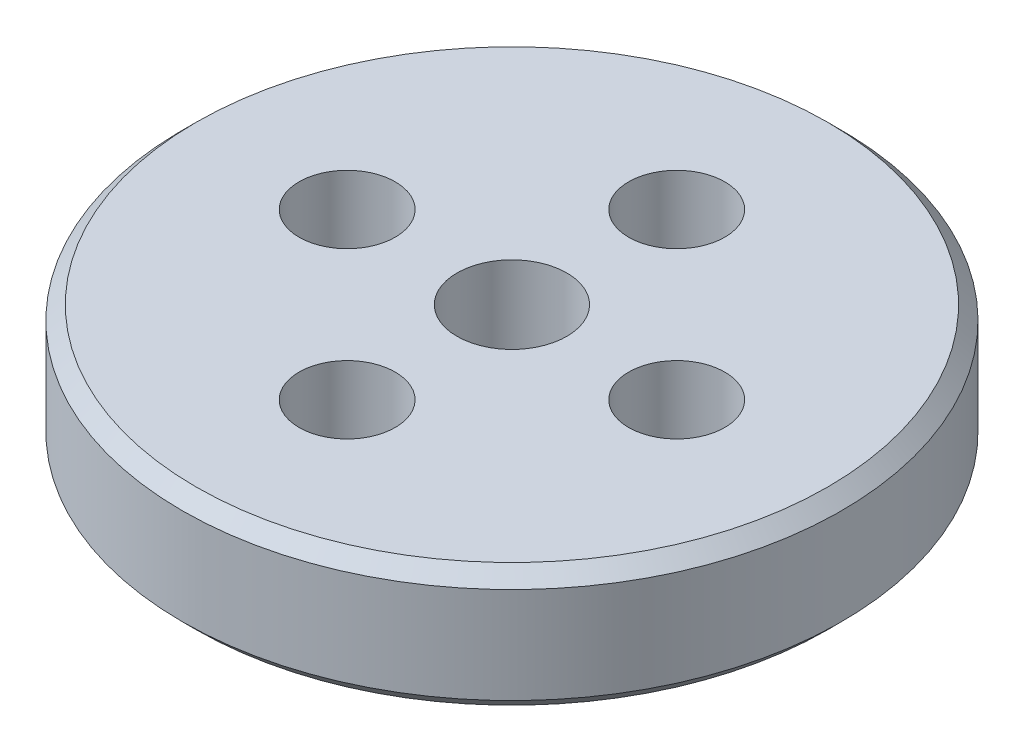
ISO-10303-21;
HEADER;
FILE_DESCRIPTION(('STEP AP214'),'2;1');
FILE_NAME('part.step','',(''),(''),'','','');
FILE_SCHEMA(('AUTOMOTIVE_DESIGN { 1 0 10303 214 1 1 1 1 }'));
ENDSEC;
DATA;
#1=APPLICATION_CONTEXT('core data for automotive mechanical design processes');
#2=APPLICATION_PROTOCOL_DEFINITION('international standard','automotive_design',2000,#1);
#3=PRODUCT_CONTEXT('',#1,'mechanical');
#4=PRODUCT('Part','Part','',(#3));
#5=PRODUCT_RELATED_PRODUCT_CATEGORY('part','',(#4));
#6=PRODUCT_DEFINITION_FORMATION('','',#4);
#7=PRODUCT_DEFINITION_CONTEXT('part definition',#1,'design');
#8=PRODUCT_DEFINITION('design','',#6,#7);
#9=PRODUCT_DEFINITION_SHAPE('','',#8);
#10=(LENGTH_UNIT() NAMED_UNIT(*) SI_UNIT(.MILLI.,.METRE.));
#11=(NAMED_UNIT(*) PLANE_ANGLE_UNIT() SI_UNIT($,.RADIAN.));
#12=(NAMED_UNIT(*) SI_UNIT($,.STERADIAN.) SOLID_ANGLE_UNIT());
#13=UNCERTAINTY_MEASURE_WITH_UNIT(LENGTH_MEASURE(1.E-05),#10,'distance_accuracy_value','');
#14=(GEOMETRIC_REPRESENTATION_CONTEXT(3) GLOBAL_UNCERTAINTY_ASSIGNED_CONTEXT((#13)) GLOBAL_UNIT_ASSIGNED_CONTEXT((#10,
#11,#12)) REPRESENTATION_CONTEXT('',''));
#15=CARTESIAN_POINT('',(0.,0.,0.));
#16=DIRECTION('',(0.,0.,1.));
#17=DIRECTION('',(1.,0.,0.));
#18=AXIS2_PLACEMENT_3D('',#15,#16,#17);
#19=CARTESIAN_POINT('',(0.,9.,0.));
#20=DIRECTION('',(0.,-1.,0.));
#21=DIRECTION('',(0.,0.,-1.));
#22=AXIS2_PLACEMENT_3D('',#19,#20,#21);
#23=CYLINDRICAL_SURFACE('',#22,24.);
#24=CARTESIAN_POINT('',(0.,1.,0.));
#25=DIRECTION('',(0.,1.,0.));
#26=DIRECTION('',(0.,0.,1.));
#27=AXIS2_PLACEMENT_3D('',#24,#25,#26);
#28=CIRCLE('',#27,24.);
#29=CARTESIAN_POINT('',(0.,1.,24.));
#30=VERTEX_POINT('',#29);
#31=EDGE_CURVE('E60',#30,#30,#28,.T.);
#32=ORIENTED_EDGE('',*,*,#31,.T.);
#33=EDGE_LOOP('',(#32));
#34=FACE_BOUND('',#33,.T.);
#35=CARTESIAN_POINT('',(0.,8.00000000000002,0.));
#36=DIRECTION('',(0.,1.,0.));
#37=DIRECTION('',(0.,0.,1.));
#38=AXIS2_PLACEMENT_3D('',#35,#36,#37);
#39=CIRCLE('',#38,24.);
#40=CARTESIAN_POINT('',(0.,8.00000000000002,24.));
#41=VERTEX_POINT('',#40);
#42=EDGE_CURVE('E66',#41,#41,#39,.F.);
#43=ORIENTED_EDGE('',*,*,#42,.T.);
#44=EDGE_LOOP('',(#43));
#45=FACE_BOUND('',#44,.T.);
#46=ADVANCED_FACE('F41',(#34,#45),#23,.T.);
#47=CARTESIAN_POINT('',(0.,9.,0.));
#48=DIRECTION('',(0.,1.,0.));
#49=DIRECTION('',(0.,0.,1.));
#50=AXIS2_PLACEMENT_3D('',#47,#48,#49);
#51=PLANE('',#50);
#52=CARTESIAN_POINT('',(0.,9.,0.));
#53=DIRECTION('',(0.,1.,0.));
#54=DIRECTION('',(0.,0.,1.));
#55=AXIS2_PLACEMENT_3D('',#52,#53,#54);
#56=CIRCLE('',#55,23.);
#57=CARTESIAN_POINT('',(0.,9.,23.));
#58=VERTEX_POINT('',#57);
#59=EDGE_CURVE('E50',#58,#58,#56,.T.);
#60=ORIENTED_EDGE('',*,*,#59,.T.);
#61=EDGE_LOOP('',(#60));
#62=FACE_BOUND('',#61,.T.);
#63=CARTESIAN_POINT('',(-11.9999999999997,9.,3.4032572508536E-13));
#64=DIRECTION('',(0.,1.,0.));
#65=DIRECTION('',(0.,0.,1.));
#66=AXIS2_PLACEMENT_3D('',#63,#64,#65);
#67=CIRCLE('',#66,3.50000000000054);
#68=CARTESIAN_POINT('',(-11.9999999999997,9.,3.50000000000089));
#69=VERTEX_POINT('',#68);
#70=EDGE_CURVE('E79',#69,#69,#67,.T.);
#71=ORIENTED_EDGE('',*,*,#70,.F.);
#72=EDGE_LOOP('',(#71));
#73=FACE_BOUND('',#72,.T.);
#74=CARTESIAN_POINT('',(6.77712297852766E-13,9.,12.));
#75=DIRECTION('',(0.,1.,0.));
#76=DIRECTION('',(0.,0.,1.));
#77=AXIS2_PLACEMENT_3D('',#74,#75,#76);
#78=CIRCLE('',#77,3.50000000000073);
#79=CARTESIAN_POINT('',(6.77712297852766E-13,9.,15.5000000000007));
#80=VERTEX_POINT('',#79);
#81=EDGE_CURVE('E107',#80,#80,#78,.T.);
#82=ORIENTED_EDGE('',*,*,#81,.F.);
#83=EDGE_LOOP('',(#82));
#84=FACE_BOUND('',#83,.T.);
#85=CARTESIAN_POINT('',(12.,9.,0.));
#86=DIRECTION('',(0.,1.,0.));
#87=DIRECTION('',(0.,0.,1.));
#88=AXIS2_PLACEMENT_3D('',#85,#86,#87);
#89=CIRCLE('',#88,3.5);
#90=CARTESIAN_POINT('',(12.,9.,3.50000000000004));
#91=VERTEX_POINT('',#90);
#92=EDGE_CURVE('E103',#91,#91,#89,.T.);
#93=ORIENTED_EDGE('',*,*,#92,.F.);
#94=EDGE_LOOP('',(#93));
#95=FACE_BOUND('',#94,.T.);
#96=CARTESIAN_POINT('',(0.,9.,-12.));
#97=DIRECTION('',(0.,1.,0.));
#98=DIRECTION('',(0.,0.,1.));
#99=AXIS2_PLACEMENT_3D('',#96,#97,#98);
#100=CIRCLE('',#99,3.5);
#101=CARTESIAN_POINT('',(0.,9.,-8.5));
#102=VERTEX_POINT('',#101);
#103=EDGE_CURVE('E99',#102,#102,#100,.T.);
#104=ORIENTED_EDGE('',*,*,#103,.F.);
#105=EDGE_LOOP('',(#104));
#106=FACE_BOUND('',#105,.T.);
#107=CARTESIAN_POINT('',(0.,9.,0.));
#108=DIRECTION('',(0.,1.,0.));
#109=DIRECTION('',(0.,0.,1.));
#110=AXIS2_PLACEMENT_3D('',#107,#108,#109);
#111=CIRCLE('',#110,4.);
#112=CARTESIAN_POINT('',(0.,9.,4.));
#113=VERTEX_POINT('',#112);
#114=EDGE_CURVE('E74',#113,#113,#111,.T.);
#115=ORIENTED_EDGE('',*,*,#114,.F.);
#116=EDGE_LOOP('',(#115));
#117=FACE_BOUND('',#116,.T.);
#118=ADVANCED_FACE('F118',(#62,#73,#84,#95,#106,#117),#51,.T.);
#119=CARTESIAN_POINT('',(0.,0.,0.));
#120=DIRECTION('',(0.,1.,0.));
#121=DIRECTION('',(0.,0.,1.));
#122=AXIS2_PLACEMENT_3D('',#119,#120,#121);
#123=PLANE('',#122);
#124=CARTESIAN_POINT('',(0.,0.,0.));
#125=DIRECTION('',(0.,1.,0.));
#126=DIRECTION('',(0.,0.,1.));
#127=AXIS2_PLACEMENT_3D('',#124,#125,#126);
#128=CIRCLE('',#127,23.);
#129=CARTESIAN_POINT('',(0.,0.,23.));
#130=VERTEX_POINT('',#129);
#131=EDGE_CURVE('E55',#130,#130,#128,.F.);
#132=ORIENTED_EDGE('',*,*,#131,.T.);
#133=EDGE_LOOP('',(#132));
#134=FACE_BOUND('',#133,.T.);
#135=CARTESIAN_POINT('',(0.,0.,0.));
#136=DIRECTION('',(0.,1.,0.));
#137=DIRECTION('',(0.,0.,1.));
#138=AXIS2_PLACEMENT_3D('',#135,#136,#137);
#139=CIRCLE('',#138,18.);
#140=CARTESIAN_POINT('',(0.,0.,18.));
#141=VERTEX_POINT('',#140);
#142=EDGE_CURVE('E70',#141,#141,#139,.T.);
#143=ORIENTED_EDGE('',*,*,#142,.T.);
#144=EDGE_LOOP('',(#143));
#145=FACE_BOUND('',#144,.T.);
#146=ADVANCED_FACE('F121',(#134,#145),#123,.F.);
#147=CARTESIAN_POINT('',(0.,9.,-12.));
#148=DIRECTION('',(0.,-1.,0.));
#149=DIRECTION('',(0.,0.,-1.));
#150=AXIS2_PLACEMENT_3D('',#147,#148,#149);
#151=CYLINDRICAL_SURFACE('',#150,3.5);
#152=ORIENTED_EDGE('',*,*,#103,.T.);
#153=EDGE_LOOP('',(#152));
#154=FACE_BOUND('',#153,.T.);
#155=CARTESIAN_POINT('',(0.,2.,-12.));
#156=DIRECTION('',(0.,1.,0.));
#157=DIRECTION('',(0.,0.,1.));
#158=AXIS2_PLACEMENT_3D('',#155,#156,#157);
#159=CIRCLE('',#158,3.5);
#160=CARTESIAN_POINT('',(0.,2.,-8.5));
#161=VERTEX_POINT('',#160);
#162=EDGE_CURVE('E80',#161,#161,#159,.T.);
#163=ORIENTED_EDGE('',*,*,#162,.F.);
#164=EDGE_LOOP('',(#163));
#165=FACE_BOUND('',#164,.T.);
#166=ADVANCED_FACE('F175',(#154,#165),#151,.F.);
#167=CARTESIAN_POINT('',(12.,9.,0.));
#168=DIRECTION('',(0.,-1.,0.));
#169=DIRECTION('',(0.,0.,-1.));
#170=AXIS2_PLACEMENT_3D('',#167,#168,#169);
#171=CYLINDRICAL_SURFACE('',#170,3.5);
#172=ORIENTED_EDGE('',*,*,#92,.T.);
#173=EDGE_LOOP('',(#172));
#174=FACE_BOUND('',#173,.T.);
#175=CARTESIAN_POINT('',(12.,2.,0.));
#176=DIRECTION('',(0.,1.,0.));
#177=DIRECTION('',(0.,0.,1.));
#178=AXIS2_PLACEMENT_3D('',#175,#176,#177);
#179=CIRCLE('',#178,3.5);
#180=CARTESIAN_POINT('',(12.,2.,3.50000000000004));
#181=VERTEX_POINT('',#180);
#182=EDGE_CURVE('E84',#181,#181,#179,.T.);
#183=ORIENTED_EDGE('',*,*,#182,.F.);
#184=EDGE_LOOP('',(#183));
#185=FACE_BOUND('',#184,.T.);
#186=ADVANCED_FACE('F180',(#174,#185),#171,.F.);
#187=CARTESIAN_POINT('',(6.77712297852766E-13,9.,12.));
#188=DIRECTION('',(0.,-1.,0.));
#189=DIRECTION('',(0.,0.,-1.));
#190=AXIS2_PLACEMENT_3D('',#187,#188,#189);
#191=CYLINDRICAL_SURFACE('',#190,3.50000000000073);
#192=ORIENTED_EDGE('',*,*,#81,.T.);
#193=EDGE_LOOP('',(#192));
#194=FACE_BOUND('',#193,.T.);
#195=CARTESIAN_POINT('',(6.77712297852766E-13,2.,12.));
#196=DIRECTION('',(0.,1.,0.));
#197=DIRECTION('',(0.,0.,1.));
#198=AXIS2_PLACEMENT_3D('',#195,#196,#197);
#199=CIRCLE('',#198,3.50000000000073);
#200=CARTESIAN_POINT('',(6.77712297852766E-13,2.,15.5000000000007));
#201=VERTEX_POINT('',#200);
#202=EDGE_CURVE('E88',#201,#201,#199,.T.);
#203=ORIENTED_EDGE('',*,*,#202,.F.);
#204=EDGE_LOOP('',(#203));
#205=FACE_BOUND('',#204,.T.);
#206=ADVANCED_FACE('F189',(#194,#205),#191,.F.);
#207=CARTESIAN_POINT('',(-11.9999999999997,9.,3.4032572508536E-13));
#208=DIRECTION('',(0.,-1.,0.));
#209=DIRECTION('',(0.,0.,-1.));
#210=AXIS2_PLACEMENT_3D('',#207,#208,#209);
#211=CYLINDRICAL_SURFACE('',#210,3.50000000000054);
#212=ORIENTED_EDGE('',*,*,#70,.T.);
#213=EDGE_LOOP('',(#212));
#214=FACE_BOUND('',#213,.T.);
#215=CARTESIAN_POINT('',(-11.9999999999997,2.,3.4032572508536E-13));
#216=DIRECTION('',(0.,1.,0.));
#217=DIRECTION('',(0.,0.,1.));
#218=AXIS2_PLACEMENT_3D('',#215,#216,#217);
#219=CIRCLE('',#218,3.50000000000054);
#220=CARTESIAN_POINT('',(-11.9999999999997,2.,3.50000000000089));
#221=VERTEX_POINT('',#220);
#222=EDGE_CURVE('E92',#221,#221,#219,.T.);
#223=ORIENTED_EDGE('',*,*,#222,.F.);
#224=EDGE_LOOP('',(#223));
#225=FACE_BOUND('',#224,.T.);
#226=ADVANCED_FACE('F115',(#214,#225),#211,.F.);
#227=CARTESIAN_POINT('',(0.,9.,0.));
#228=DIRECTION('',(0.,-1.,0.));
#229=DIRECTION('',(0.,0.,-1.));
#230=AXIS2_PLACEMENT_3D('',#227,#228,#229);
#231=CYLINDRICAL_SURFACE('',#230,4.);
#232=ORIENTED_EDGE('',*,*,#114,.T.);
#233=EDGE_LOOP('',(#232));
#234=FACE_BOUND('',#233,.T.);
#235=CARTESIAN_POINT('',(0.,2.,0.));
#236=DIRECTION('',(0.,1.,0.));
#237=DIRECTION('',(0.,0.,1.));
#238=AXIS2_PLACEMENT_3D('',#235,#236,#237);
#239=CIRCLE('',#238,4.);
#240=CARTESIAN_POINT('',(0.,2.,4.));
#241=VERTEX_POINT('',#240);
#242=EDGE_CURVE('E75',#241,#241,#239,.T.);
#243=ORIENTED_EDGE('',*,*,#242,.F.);
#244=EDGE_LOOP('',(#243));
#245=FACE_BOUND('',#244,.T.);
#246=ADVANCED_FACE('F131',(#234,#245),#231,.F.);
#247=CARTESIAN_POINT('',(0.,2.,0.));
#248=DIRECTION('',(0.,1.,0.));
#249=DIRECTION('',(0.,0.,1.));
#250=AXIS2_PLACEMENT_3D('',#247,#248,#249);
#251=PLANE('',#250);
#252=CARTESIAN_POINT('',(0.,2.,0.));
#253=DIRECTION('',(0.,1.,0.));
#254=DIRECTION('',(0.,0.,1.));
#255=AXIS2_PLACEMENT_3D('',#252,#253,#254);
#256=CIRCLE('',#255,16.);
#257=CARTESIAN_POINT('',(0.,2.,16.));
#258=VERTEX_POINT('',#257);
#259=EDGE_CURVE('E10',#258,#258,#256,.F.);
#260=ORIENTED_EDGE('',*,*,#259,.T.);
#261=EDGE_LOOP('',(#260));
#262=FACE_BOUND('',#261,.T.);
#263=ORIENTED_EDGE('',*,*,#222,.T.);
#264=EDGE_LOOP('',(#263));
#265=FACE_BOUND('',#264,.T.);
#266=ORIENTED_EDGE('',*,*,#202,.T.);
#267=EDGE_LOOP('',(#266));
#268=FACE_BOUND('',#267,.T.);
#269=ORIENTED_EDGE('',*,*,#182,.T.);
#270=EDGE_LOOP('',(#269));
#271=FACE_BOUND('',#270,.T.);
#272=ORIENTED_EDGE('',*,*,#162,.T.);
#273=EDGE_LOOP('',(#272));
#274=FACE_BOUND('',#273,.T.);
#275=ORIENTED_EDGE('',*,*,#242,.T.);
#276=EDGE_LOOP('',(#275));
#277=FACE_BOUND('',#276,.T.);
#278=ADVANCED_FACE('F134',(#262,#265,#268,#271,#274,#277),#251,.F.);
#279=CARTESIAN_POINT('',(0.,1.,0.));
#280=DIRECTION('',(0.,1.,0.));
#281=DIRECTION('',(0.,0.,1.));
#282=AXIS2_PLACEMENT_3D('',#279,#280,#281);
#283=CONICAL_SURFACE('',#282,24.,0.785398163397452);
#284=ORIENTED_EDGE('',*,*,#131,.F.);
#285=EDGE_LOOP('',(#284));
#286=FACE_BOUND('',#285,.T.);
#287=ORIENTED_EDGE('',*,*,#31,.F.);
#288=EDGE_LOOP('',(#287));
#289=FACE_BOUND('',#288,.T.);
#290=ADVANCED_FACE('F139',(#286,#289),#283,.T.);
#291=CARTESIAN_POINT('',(0.,9.,0.));
#292=DIRECTION('',(0.,-1.,0.));
#293=DIRECTION('',(0.,0.,-1.));
#294=AXIS2_PLACEMENT_3D('',#291,#292,#293);
#295=CONICAL_SURFACE('',#294,23.,0.785398163397448);
#296=ORIENTED_EDGE('',*,*,#42,.F.);
#297=EDGE_LOOP('',(#296));
#298=FACE_BOUND('',#297,.T.);
#299=ORIENTED_EDGE('',*,*,#59,.F.);
#300=EDGE_LOOP('',(#299));
#301=FACE_BOUND('',#300,.T.);
#302=ADVANCED_FACE('F144',(#298,#301),#295,.T.);
#303=CARTESIAN_POINT('',(0.,0.,0.));
#304=DIRECTION('',(0.,-1.,0.));
#305=DIRECTION('',(0.,0.,-1.));
#306=AXIS2_PLACEMENT_3D('',#303,#304,#305);
#307=CONICAL_SURFACE('',#306,18.,0.785398163397443);
#308=ORIENTED_EDGE('',*,*,#259,.F.);
#309=EDGE_LOOP('',(#308));
#310=FACE_BOUND('',#309,.T.);
#311=ORIENTED_EDGE('',*,*,#142,.F.);
#312=EDGE_LOOP('',(#311));
#313=FACE_BOUND('',#312,.T.);
#314=ADVANCED_FACE('F44',(#310,#313),#307,.F.);
#315=CLOSED_SHELL('',(#46,#118,#146,#166,#186,#206,#226,#246,#278,#290,#302,#314));
#316=MANIFOLD_SOLID_BREP('B2',#315);
#317=ADVANCED_BREP_SHAPE_REPRESENTATION('',(#18,#316),#14);
#318=SHAPE_DEFINITION_REPRESENTATION(#9,#317);
ENDSEC;
END-ISO-10303-21;
